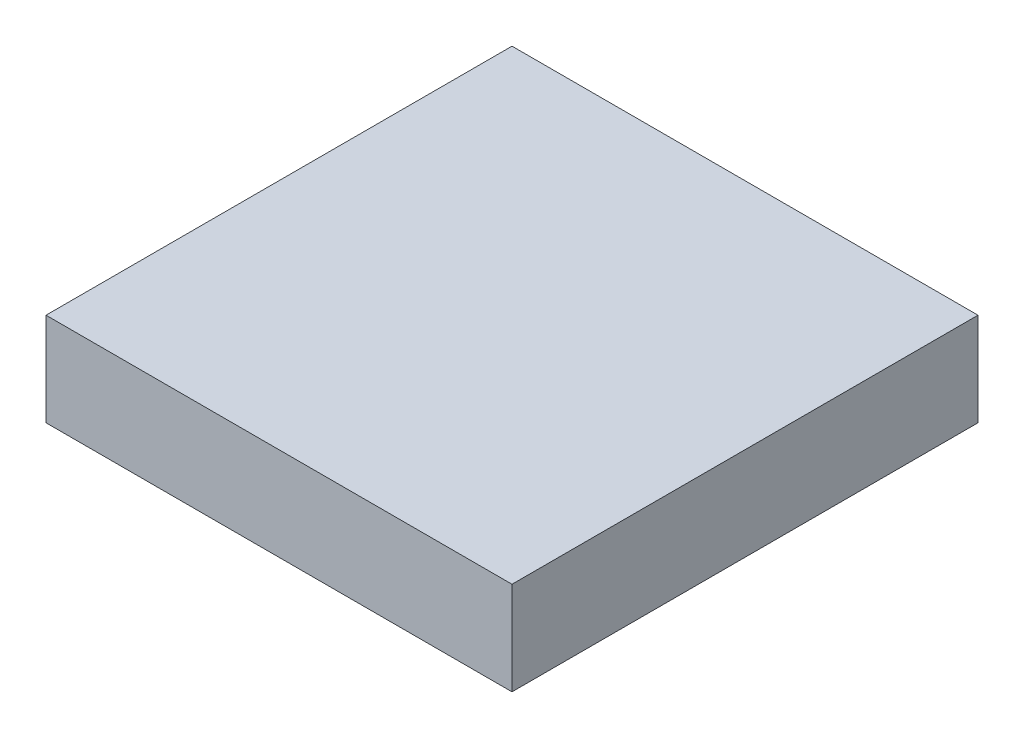
ISO-10303-21;
HEADER;
FILE_DESCRIPTION(('STEP AP214'),'2;1');
FILE_NAME('part.step','',(''),(''),'','','');
FILE_SCHEMA(('AUTOMOTIVE_DESIGN { 1 0 10303 214 1 1 1 1 }'));
ENDSEC;
DATA;
#1=APPLICATION_CONTEXT('core data for automotive mechanical design processes');
#2=APPLICATION_PROTOCOL_DEFINITION('international standard','automotive_design',2000,#1);
#3=PRODUCT_CONTEXT('',#1,'mechanical');
#4=PRODUCT('Part','Part','',(#3));
#5=PRODUCT_RELATED_PRODUCT_CATEGORY('part','',(#4));
#6=PRODUCT_DEFINITION_FORMATION('','',#4);
#7=PRODUCT_DEFINITION_CONTEXT('part definition',#1,'design');
#8=PRODUCT_DEFINITION('design','',#6,#7);
#9=PRODUCT_DEFINITION_SHAPE('','',#8);
#10=(LENGTH_UNIT() NAMED_UNIT(*) SI_UNIT(.MILLI.,.METRE.));
#11=(NAMED_UNIT(*) PLANE_ANGLE_UNIT() SI_UNIT($,.RADIAN.));
#12=(NAMED_UNIT(*) SI_UNIT($,.STERADIAN.) SOLID_ANGLE_UNIT());
#13=UNCERTAINTY_MEASURE_WITH_UNIT(LENGTH_MEASURE(1.E-05),#10,'distance_accuracy_value','');
#14=(GEOMETRIC_REPRESENTATION_CONTEXT(3) GLOBAL_UNCERTAINTY_ASSIGNED_CONTEXT((#13)) GLOBAL_UNIT_ASSIGNED_CONTEXT((#10,
#11,#12)) REPRESENTATION_CONTEXT('',''));
#15=CARTESIAN_POINT('',(0.,0.,0.));
#16=DIRECTION('',(0.,0.,1.));
#17=DIRECTION('',(1.,0.,0.));
#18=AXIS2_PLACEMENT_3D('',#15,#16,#17);
#19=CARTESIAN_POINT('',(0.,0.,0.));
#20=DIRECTION('',(0.,-1.,0.));
#21=DIRECTION('',(0.,0.,-1.));
#22=AXIS2_PLACEMENT_3D('',#19,#20,#21);
#23=PLANE('',#22);
#24=DIRECTION('',(0.,0.,1.));
#25=VECTOR('',#24,1.);
#26=CARTESIAN_POINT('',(0.,0.,0.));
#27=LINE('',#26,#25);
#28=CARTESIAN_POINT('',(0.,0.,-16.));
#29=VERTEX_POINT('',#28);
#30=CARTESIAN_POINT('',(0.,0.,0.));
#31=VERTEX_POINT('',#30);
#32=EDGE_CURVE('E134',#29,#31,#27,.T.);
#33=ORIENTED_EDGE('',*,*,#32,.F.);
#34=DIRECTION('',(-1.,0.,0.));
#35=VECTOR('',#34,1.);
#36=CARTESIAN_POINT('',(0.,0.,-16.));
#37=LINE('',#36,#35);
#38=CARTESIAN_POINT('',(16.,0.,-16.));
#39=VERTEX_POINT('',#38);
#40=EDGE_CURVE('E82',#39,#29,#37,.T.);
#41=ORIENTED_EDGE('',*,*,#40,.F.);
#42=DIRECTION('',(0.,0.,-1.));
#43=VECTOR('',#42,1.);
#44=CARTESIAN_POINT('',(16.,0.,0.));
#45=LINE('',#44,#43);
#46=CARTESIAN_POINT('',(16.,0.,0.));
#47=VERTEX_POINT('',#46);
#48=EDGE_CURVE('E162',#47,#39,#45,.T.);
#49=ORIENTED_EDGE('',*,*,#48,.F.);
#50=DIRECTION('',(1.,0.,0.));
#51=VECTOR('',#50,1.);
#52=CARTESIAN_POINT('',(0.,0.,0.));
#53=LINE('',#52,#51);
#54=EDGE_CURVE('E138',#31,#47,#53,.T.);
#55=ORIENTED_EDGE('',*,*,#54,.F.);
#56=EDGE_LOOP('',(#33,#41,#49,#55));
#57=FACE_BOUND('',#56,.T.);
#58=DIRECTION('',(-1.,0.,0.));
#59=VECTOR('',#58,1.);
#60=CARTESIAN_POINT('',(0.,0.,-14.4));
#61=LINE('',#60,#59);
#62=CARTESIAN_POINT('',(14.4,0.,-14.4));
#63=VERTEX_POINT('',#62);
#64=CARTESIAN_POINT('',(1.6,0.,-14.4));
#65=VERTEX_POINT('',#64);
#66=EDGE_CURVE('E129',#63,#65,#61,.T.);
#67=ORIENTED_EDGE('',*,*,#66,.T.);
#68=DIRECTION('',(0.,0.,1.));
#69=VECTOR('',#68,1.);
#70=CARTESIAN_POINT('',(1.6,0.,0.));
#71=LINE('',#70,#69);
#72=CARTESIAN_POINT('',(1.6,0.,-1.6));
#73=VERTEX_POINT('',#72);
#74=EDGE_CURVE('E148',#65,#73,#71,.T.);
#75=ORIENTED_EDGE('',*,*,#74,.T.);
#76=DIRECTION('',(1.,0.,0.));
#77=VECTOR('',#76,1.);
#78=CARTESIAN_POINT('',(0.,0.,-1.6));
#79=LINE('',#78,#77);
#80=CARTESIAN_POINT('',(14.4,0.,-1.6));
#81=VERTEX_POINT('',#80);
#82=EDGE_CURVE('E133',#73,#81,#79,.T.);
#83=ORIENTED_EDGE('',*,*,#82,.T.);
#84=DIRECTION('',(0.,0.,-1.));
#85=VECTOR('',#84,1.);
#86=CARTESIAN_POINT('',(14.4,0.,0.));
#87=LINE('',#86,#85);
#88=EDGE_CURVE('E52',#81,#63,#87,.T.);
#89=ORIENTED_EDGE('',*,*,#88,.T.);
#90=EDGE_LOOP('',(#67,#75,#83,#89));
#91=FACE_BOUND('',#90,.T.);
#92=ADVANCED_FACE('F37',(#57,#91),#23,.T.);
#93=CARTESIAN_POINT('',(0.,3.2,0.));
#94=DIRECTION('',(1.,0.,0.));
#95=DIRECTION('',(0.,0.,-1.));
#96=AXIS2_PLACEMENT_3D('',#93,#94,#95);
#97=PLANE('',#96);
#98=ORIENTED_EDGE('',*,*,#32,.T.);
#99=DIRECTION('',(0.,-1.,0.));
#100=VECTOR('',#99,1.);
#101=CARTESIAN_POINT('',(0.,3.2,0.));
#102=LINE('',#101,#100);
#103=CARTESIAN_POINT('',(0.,3.2,0.));
#104=VERTEX_POINT('',#103);
#105=EDGE_CURVE('E11',#104,#31,#102,.T.);
#106=ORIENTED_EDGE('',*,*,#105,.F.);
#107=DIRECTION('',(0.,0.,1.));
#108=VECTOR('',#107,1.);
#109=CARTESIAN_POINT('',(0.,3.2,0.));
#110=LINE('',#109,#108);
#111=CARTESIAN_POINT('',(0.,3.2,-16.));
#112=VERTEX_POINT('',#111);
#113=EDGE_CURVE('E154',#112,#104,#110,.T.);
#114=ORIENTED_EDGE('',*,*,#113,.F.);
#115=DIRECTION('',(0.,-1.,0.));
#116=VECTOR('',#115,1.);
#117=CARTESIAN_POINT('',(0.,3.2,-16.));
#118=LINE('',#117,#116);
#119=EDGE_CURVE('E159',#112,#29,#118,.T.);
#120=ORIENTED_EDGE('',*,*,#119,.T.);
#121=EDGE_LOOP('',(#98,#106,#114,#120));
#122=FACE_BOUND('',#121,.T.);
#123=ADVANCED_FACE('F39',(#122),#97,.F.);
#124=CARTESIAN_POINT('',(0.,3.2,0.));
#125=DIRECTION('',(0.,0.,-1.));
#126=DIRECTION('',(-1.,0.,0.));
#127=AXIS2_PLACEMENT_3D('',#124,#125,#126);
#128=PLANE('',#127);
#129=ORIENTED_EDGE('',*,*,#54,.T.);
#130=DIRECTION('',(0.,-1.,0.));
#131=VECTOR('',#130,1.);
#132=CARTESIAN_POINT('',(16.,3.2,0.));
#133=LINE('',#132,#131);
#134=CARTESIAN_POINT('',(16.,3.2,0.));
#135=VERTEX_POINT('',#134);
#136=EDGE_CURVE('E45',#135,#47,#133,.T.);
#137=ORIENTED_EDGE('',*,*,#136,.F.);
#138=DIRECTION('',(1.,0.,0.));
#139=VECTOR('',#138,1.);
#140=CARTESIAN_POINT('',(0.,3.2,0.));
#141=LINE('',#140,#139);
#142=EDGE_CURVE('E89',#104,#135,#141,.T.);
#143=ORIENTED_EDGE('',*,*,#142,.F.);
#144=ORIENTED_EDGE('',*,*,#105,.T.);
#145=EDGE_LOOP('',(#129,#137,#143,#144));
#146=FACE_BOUND('',#145,.T.);
#147=ADVANCED_FACE('F188',(#146),#128,.F.);
#148=CARTESIAN_POINT('',(16.,3.2,0.));
#149=DIRECTION('',(-1.,0.,0.));
#150=DIRECTION('',(0.,0.,1.));
#151=AXIS2_PLACEMENT_3D('',#148,#149,#150);
#152=PLANE('',#151);
#153=ORIENTED_EDGE('',*,*,#48,.T.);
#154=DIRECTION('',(0.,-1.,0.));
#155=VECTOR('',#154,1.);
#156=CARTESIAN_POINT('',(16.,3.2,-16.));
#157=LINE('',#156,#155);
#158=CARTESIAN_POINT('',(16.,3.2,-16.));
#159=VERTEX_POINT('',#158);
#160=EDGE_CURVE('E166',#159,#39,#157,.T.);
#161=ORIENTED_EDGE('',*,*,#160,.F.);
#162=DIRECTION('',(0.,0.,-1.));
#163=VECTOR('',#162,1.);
#164=CARTESIAN_POINT('',(16.,3.2,0.));
#165=LINE('',#164,#163);
#166=EDGE_CURVE('E157',#135,#159,#165,.T.);
#167=ORIENTED_EDGE('',*,*,#166,.F.);
#168=ORIENTED_EDGE('',*,*,#136,.T.);
#169=EDGE_LOOP('',(#153,#161,#167,#168));
#170=FACE_BOUND('',#169,.T.);
#171=ADVANCED_FACE('F171',(#170),#152,.F.);
#172=CARTESIAN_POINT('',(0.,3.2,-16.));
#173=DIRECTION('',(0.,0.,1.));
#174=DIRECTION('',(1.,0.,0.));
#175=AXIS2_PLACEMENT_3D('',#172,#173,#174);
#176=PLANE('',#175);
#177=ORIENTED_EDGE('',*,*,#40,.T.);
#178=ORIENTED_EDGE('',*,*,#119,.F.);
#179=DIRECTION('',(-1.,0.,0.));
#180=VECTOR('',#179,1.);
#181=CARTESIAN_POINT('',(0.,3.2,-16.));
#182=LINE('',#181,#180);
#183=EDGE_CURVE('E61',#159,#112,#182,.T.);
#184=ORIENTED_EDGE('',*,*,#183,.F.);
#185=ORIENTED_EDGE('',*,*,#160,.T.);
#186=EDGE_LOOP('',(#177,#178,#184,#185));
#187=FACE_BOUND('',#186,.T.);
#188=ADVANCED_FACE('F179',(#187),#176,.F.);
#189=CARTESIAN_POINT('',(0.,3.2,0.));
#190=DIRECTION('',(0.,-1.,0.));
#191=DIRECTION('',(0.,0.,-1.));
#192=AXIS2_PLACEMENT_3D('',#189,#190,#191);
#193=PLANE('',#192);
#194=ORIENTED_EDGE('',*,*,#113,.T.);
#195=ORIENTED_EDGE('',*,*,#142,.T.);
#196=ORIENTED_EDGE('',*,*,#166,.T.);
#197=ORIENTED_EDGE('',*,*,#183,.T.);
#198=EDGE_LOOP('',(#194,#195,#196,#197));
#199=FACE_BOUND('',#198,.T.);
#200=ADVANCED_FACE('F181',(#199),#193,.F.);
#201=CARTESIAN_POINT('',(1.6,3.2,0.));
#202=DIRECTION('',(1.,0.,0.));
#203=DIRECTION('',(0.,0.,-1.));
#204=AXIS2_PLACEMENT_3D('',#201,#202,#203);
#205=PLANE('',#204);
#206=ORIENTED_EDGE('',*,*,#74,.F.);
#207=DIRECTION('',(0.,-1.,0.));
#208=VECTOR('',#207,1.);
#209=CARTESIAN_POINT('',(1.6,3.2,-14.4));
#210=LINE('',#209,#208);
#211=CARTESIAN_POINT('',(1.6,1.6,-14.4));
#212=VERTEX_POINT('',#211);
#213=EDGE_CURVE('E128',#212,#65,#210,.T.);
#214=ORIENTED_EDGE('',*,*,#213,.F.);
#215=DIRECTION('',(0.,0.,1.));
#216=VECTOR('',#215,1.);
#217=CARTESIAN_POINT('',(1.6,1.6,0.));
#218=LINE('',#217,#216);
#219=CARTESIAN_POINT('',(1.6,1.6,-1.6));
#220=VERTEX_POINT('',#219);
#221=EDGE_CURVE('E116',#212,#220,#218,.T.);
#222=ORIENTED_EDGE('',*,*,#221,.T.);
#223=DIRECTION('',(0.,-1.,0.));
#224=VECTOR('',#223,1.);
#225=CARTESIAN_POINT('',(1.6,3.2,-1.6));
#226=LINE('',#225,#224);
#227=EDGE_CURVE('E126',#220,#73,#226,.T.);
#228=ORIENTED_EDGE('',*,*,#227,.T.);
#229=EDGE_LOOP('',(#206,#214,#222,#228));
#230=FACE_BOUND('',#229,.T.);
#231=ADVANCED_FACE('F125',(#230),#205,.T.);
#232=CARTESIAN_POINT('',(0.,3.2,-1.6));
#233=DIRECTION('',(0.,0.,-1.));
#234=DIRECTION('',(-1.,0.,0.));
#235=AXIS2_PLACEMENT_3D('',#232,#233,#234);
#236=PLANE('',#235);
#237=ORIENTED_EDGE('',*,*,#82,.F.);
#238=ORIENTED_EDGE('',*,*,#227,.F.);
#239=DIRECTION('',(1.,0.,0.));
#240=VECTOR('',#239,1.);
#241=CARTESIAN_POINT('',(0.,1.6,-1.6));
#242=LINE('',#241,#240);
#243=CARTESIAN_POINT('',(14.4,1.6,-1.6));
#244=VERTEX_POINT('',#243);
#245=EDGE_CURVE('E112',#220,#244,#242,.T.);
#246=ORIENTED_EDGE('',*,*,#245,.T.);
#247=DIRECTION('',(0.,-1.,0.));
#248=VECTOR('',#247,1.);
#249=CARTESIAN_POINT('',(14.4,3.2,-1.6));
#250=LINE('',#249,#248);
#251=EDGE_CURVE('E135',#244,#81,#250,.T.);
#252=ORIENTED_EDGE('',*,*,#251,.T.);
#253=EDGE_LOOP('',(#237,#238,#246,#252));
#254=FACE_BOUND('',#253,.T.);
#255=ADVANCED_FACE('F131',(#254),#236,.T.);
#256=CARTESIAN_POINT('',(14.4,3.2,0.));
#257=DIRECTION('',(-1.,0.,0.));
#258=DIRECTION('',(0.,0.,1.));
#259=AXIS2_PLACEMENT_3D('',#256,#257,#258);
#260=PLANE('',#259);
#261=ORIENTED_EDGE('',*,*,#88,.F.);
#262=ORIENTED_EDGE('',*,*,#251,.F.);
#263=DIRECTION('',(0.,0.,-1.));
#264=VECTOR('',#263,1.);
#265=CARTESIAN_POINT('',(14.4,1.6,0.));
#266=LINE('',#265,#264);
#267=CARTESIAN_POINT('',(14.4,1.6,-14.4));
#268=VERTEX_POINT('',#267);
#269=EDGE_CURVE('E117',#244,#268,#266,.T.);
#270=ORIENTED_EDGE('',*,*,#269,.T.);
#271=DIRECTION('',(0.,-1.,0.));
#272=VECTOR('',#271,1.);
#273=CARTESIAN_POINT('',(14.4,3.2,-14.4));
#274=LINE('',#273,#272);
#275=EDGE_CURVE('E140',#268,#63,#274,.T.);
#276=ORIENTED_EDGE('',*,*,#275,.T.);
#277=EDGE_LOOP('',(#261,#262,#270,#276));
#278=FACE_BOUND('',#277,.T.);
#279=ADVANCED_FACE('F201',(#278),#260,.T.);
#280=CARTESIAN_POINT('',(0.,3.2,-14.4));
#281=DIRECTION('',(0.,0.,1.));
#282=DIRECTION('',(1.,0.,0.));
#283=AXIS2_PLACEMENT_3D('',#280,#281,#282);
#284=PLANE('',#283);
#285=ORIENTED_EDGE('',*,*,#66,.F.);
#286=ORIENTED_EDGE('',*,*,#275,.F.);
#287=DIRECTION('',(-1.,0.,0.));
#288=VECTOR('',#287,1.);
#289=CARTESIAN_POINT('',(0.,1.6,-14.4));
#290=LINE('',#289,#288);
#291=EDGE_CURVE('E143',#268,#212,#290,.T.);
#292=ORIENTED_EDGE('',*,*,#291,.T.);
#293=ORIENTED_EDGE('',*,*,#213,.T.);
#294=EDGE_LOOP('',(#285,#286,#292,#293));
#295=FACE_BOUND('',#294,.T.);
#296=ADVANCED_FACE('F198',(#295),#284,.T.);
#297=CARTESIAN_POINT('',(0.,1.6,0.));
#298=DIRECTION('',(0.,-1.,0.));
#299=DIRECTION('',(0.,0.,-1.));
#300=AXIS2_PLACEMENT_3D('',#297,#298,#299);
#301=PLANE('',#300);
#302=ORIENTED_EDGE('',*,*,#221,.F.);
#303=ORIENTED_EDGE('',*,*,#291,.F.);
#304=ORIENTED_EDGE('',*,*,#269,.F.);
#305=ORIENTED_EDGE('',*,*,#245,.F.);
#306=EDGE_LOOP('',(#302,#303,#304,#305));
#307=FACE_BOUND('',#306,.T.);
#308=ADVANCED_FACE('F114',(#307),#301,.T.);
#309=CLOSED_SHELL('',(#92,#123,#147,#171,#188,#200,#231,#255,#279,#296,#308));
#310=MANIFOLD_SOLID_BREP('B2',#309);
#311=ADVANCED_BREP_SHAPE_REPRESENTATION('',(#18,#310),#14);
#312=SHAPE_DEFINITION_REPRESENTATION(#9,#311);
ENDSEC;
END-ISO-10303-21;
